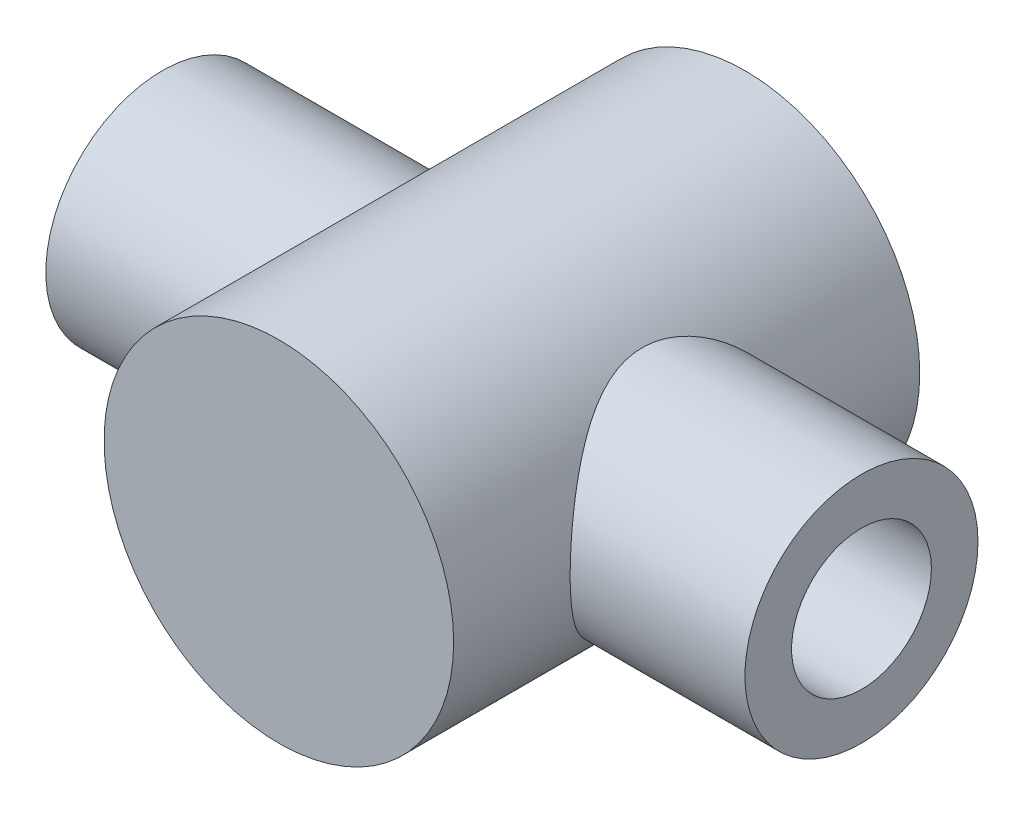
ISO-10303-21;
HEADER;
FILE_DESCRIPTION(('STEP AP214'),'2;1');
FILE_NAME('part.step','',(''),(''),'','','');
FILE_SCHEMA(('AUTOMOTIVE_DESIGN { 1 0 10303 214 1 1 1 1 }'));
ENDSEC;
DATA;
#1=APPLICATION_CONTEXT('core data for automotive mechanical design processes');
#2=APPLICATION_PROTOCOL_DEFINITION('international standard','automotive_design',2000,#1);
#3=PRODUCT_CONTEXT('',#1,'mechanical');
#4=PRODUCT('Part','Part','',(#3));
#5=PRODUCT_RELATED_PRODUCT_CATEGORY('part','',(#4));
#6=PRODUCT_DEFINITION_FORMATION('','',#4);
#7=PRODUCT_DEFINITION_CONTEXT('part definition',#1,'design');
#8=PRODUCT_DEFINITION('design','',#6,#7);
#9=PRODUCT_DEFINITION_SHAPE('','',#8);
#10=(LENGTH_UNIT() NAMED_UNIT(*) SI_UNIT(.MILLI.,.METRE.));
#11=(NAMED_UNIT(*) PLANE_ANGLE_UNIT() SI_UNIT($,.RADIAN.));
#12=(NAMED_UNIT(*) SI_UNIT($,.STERADIAN.) SOLID_ANGLE_UNIT());
#13=UNCERTAINTY_MEASURE_WITH_UNIT(LENGTH_MEASURE(1.E-05),#10,'distance_accuracy_value','');
#14=(GEOMETRIC_REPRESENTATION_CONTEXT(3) GLOBAL_UNCERTAINTY_ASSIGNED_CONTEXT((#13)) GLOBAL_UNIT_ASSIGNED_CONTEXT((#10,
#11,#12)) REPRESENTATION_CONTEXT('',''));
#15=CARTESIAN_POINT('',(0.,0.,0.));
#16=DIRECTION('',(0.,0.,1.));
#17=DIRECTION('',(1.,0.,0.));
#18=AXIS2_PLACEMENT_3D('',#15,#16,#17);
#19=CARTESIAN_POINT('',(0.,0.,40.));
#20=DIRECTION('',(0.,0.,-1.));
#21=DIRECTION('',(-1.,0.,0.));
#22=AXIS2_PLACEMENT_3D('',#19,#20,#21);
#23=CYLINDRICAL_SURFACE('',#22,15.);
#24=CARTESIAN_POINT('',(-15.,0.,30.));
#25=CARTESIAN_POINT('',(-14.9999999330355,-0.25121602505803,29.9999999353495));
#26=CARTESIAN_POINT('',(-14.9936756382587,-0.50243329641179,29.9905209450216));
#27=CARTESIAN_POINT('',(-14.968537725491,-1.00281430621742,29.9527543540569));
#28=CARTESIAN_POINT('',(-14.949724041765,-1.25197803385393,29.9244666544247));
#29=CARTESIAN_POINT('',(-14.900062607298,-1.74639437147615,29.8495001443495));
#30=CARTESIAN_POINT('',(-14.8692101655419,-1.99164541802644,29.8028141647733));
#31=CARTESIAN_POINT('',(-14.7962049328406,-2.47636835109205,29.6917197603869));
#32=CARTESIAN_POINT('',(-14.7540520052543,-2.71584016768893,29.6273111212808));
#33=CARTESIAN_POINT('',(-14.6596225678735,-3.18634157579506,29.4819602405573));
#34=CARTESIAN_POINT('',(-14.6073953835842,-3.41740603302261,29.4010984550164));
#35=CARTESIAN_POINT('',(-14.4937836667137,-3.87103535608821,29.2235793171626));
#36=CARTESIAN_POINT('',(-14.4323991815098,-4.09360026589291,29.1269220465706));
#37=CARTESIAN_POINT('',(-14.3016824454347,-4.52919238259836,28.9187823438108));
#38=CARTESIAN_POINT('',(-14.2323514695008,-4.74222111188152,28.8073022893566));
#39=CARTESIAN_POINT('',(-14.086975078723,-5.15806897823306,28.5703919232153));
#40=CARTESIAN_POINT('',(-14.0109271670256,-5.36088427435106,28.4449564194008));
#41=CARTESIAN_POINT('',(-13.846795493068,-5.77229179252596,28.169880107123));
#42=CARTESIAN_POINT('',(-13.7582376430911,-5.97992610161554,28.0190898124267));
#43=CARTESIAN_POINT('',(-13.5764689970333,-6.38186231730968,27.7030661181971));
#44=CARTESIAN_POINT('',(-13.4832562003888,-6.57615840484502,27.5378264854341));
#45=CARTESIAN_POINT('',(-13.2938516889865,-6.95109161684714,27.1935518264849));
#46=CARTESIAN_POINT('',(-13.1976561722971,-7.13171020600087,27.0144987209747));
#47=CARTESIAN_POINT('',(-13.0042893469472,-7.47849345473134,26.6435373382512));
#48=CARTESIAN_POINT('',(-12.9071183637111,-7.64466276695229,26.4516332345341));
#49=CARTESIAN_POINT('',(-12.6984183321707,-7.98727084465364,26.0241138153235));
#50=CARTESIAN_POINT('',(-12.5870482743966,-8.16117931320375,25.7863846756156));
#51=CARTESIAN_POINT('',(-12.3688469609622,-8.48824389065339,25.2949828836545));
#52=CARTESIAN_POINT('',(-12.2620167396837,-8.64139528736315,25.0413066302189));
#53=CARTESIAN_POINT('',(-12.0567536678671,-8.92554542356295,24.5191637706027));
#54=CARTESIAN_POINT('',(-11.958307425287,-9.05657983313836,24.2507219237275));
#55=CARTESIAN_POINT('',(-11.7736552489426,-9.2953668655437,23.6995014922921));
#56=CARTESIAN_POINT('',(-11.6874497570146,-9.4031186480483,23.416722390721));
#57=CARTESIAN_POINT('',(-11.554164407184,-9.56603073076105,22.9219751266933));
#58=CARTESIAN_POINT('',(-11.5029747857298,-9.62739262612926,22.7131395869155));
#59=CARTESIAN_POINT('',(-11.4105753109273,-9.73672940324514,22.289937274223));
#60=CARTESIAN_POINT('',(-11.3693590511558,-9.78471288169701,22.0755741504336));
#61=CARTESIAN_POINT('',(-11.2983421435493,-9.86663115695275,21.6425809785492));
#62=CARTESIAN_POINT('',(-11.2685273567868,-9.90058335814109,21.4239565709598));
#63=CARTESIAN_POINT('',(-11.221387591901,-9.95398099415626,20.9835887309118));
#64=CARTESIAN_POINT('',(-11.2040626822259,-9.97342634948116,20.7618452813667));
#65=CARTESIAN_POINT('',(-11.1825789027742,-9.99750949727822,20.3159869025666));
#66=CARTESIAN_POINT('',(-11.1784748508786,-10.0020856379335,20.0918659554354));
#67=CARTESIAN_POINT('',(-11.1837650844345,-9.9961699136916,19.6439846703281));
#68=CARTESIAN_POINT('',(-11.1931594157374,-9.98567799761094,19.4202243335797));
#69=CARTESIAN_POINT('',(-11.2250543429254,-9.94981025476011,18.9746874522769));
#70=CARTESIAN_POINT('',(-11.2475646772114,-9.92442336863968,18.7529125062035));
#71=CARTESIAN_POINT('',(-11.3047790826166,-9.85920094420808,18.313112536714));
#72=CARTESIAN_POINT('',(-11.3394833862946,-9.81936513033175,18.0950875848997));
#73=CARTESIAN_POINT('',(-11.4180019094514,-9.72793320006853,17.6736922309987));
#74=CARTESIAN_POINT('',(-11.4613417591393,-9.67693962238987,17.4701015448693));
#75=CARTESIAN_POINT('',(-11.5566568857338,-9.56290804839144,17.0683728775239));
#76=CARTESIAN_POINT('',(-11.6086351042463,-9.49986594811239,16.8702367806307));
#77=CARTESIAN_POINT('',(-11.7754502619445,-9.29354494113032,16.2850346702939));
#78=CARTESIAN_POINT('',(-11.9012104503488,-9.13302364641689,15.9069591042848));
#79=CARTESIAN_POINT('',(-12.1171285127346,-8.84272153741116,15.323856241402));
#80=CARTESIAN_POINT('',(-12.2015387549069,-8.72612786560377,15.1098373489876));
#81=CARTESIAN_POINT('',(-12.3748717362542,-8.47852404512043,14.6921259467744));
#82=CARTESIAN_POINT('',(-12.4637949008305,-8.34751253601214,14.4884344140937));
#83=CARTESIAN_POINT('',(-12.6442740511078,-8.07152743445186,14.0916213405095));
#84=CARTESIAN_POINT('',(-12.7358328434522,-7.92653854045352,13.8985117550921));
#85=CARTESIAN_POINT('',(-12.9196994873306,-7.62317723911379,13.5234781012259));
#86=CARTESIAN_POINT('',(-13.0120073783843,-7.46480412146614,13.341554627315));
#87=CARTESIAN_POINT('',(-13.2155248866167,-7.09947419488298,12.9513484019405));
#88=CARTESIAN_POINT('',(-13.3265151977751,-6.88940798266188,12.7458483161932));
#89=CARTESIAN_POINT('',(-13.5442982668685,-6.45073383646427,12.3531243284252));
#90=CARTESIAN_POINT('',(-13.6510902499499,-6.22212250338512,12.1659037907511));
#91=CARTESIAN_POINT('',(-13.8576700674927,-5.74734305844845,11.8112408388158));
#92=CARTESIAN_POINT('',(-13.9574630115838,-5.50118802469018,11.6437839338812));
#93=CARTESIAN_POINT('',(-14.1474838136551,-4.99223677264768,11.3301173923021));
#94=CARTESIAN_POINT('',(-14.2377143016267,-4.72944516189957,11.1839019094408));
#95=CARTESIAN_POINT('',(-14.3895846157167,-4.24166531219498,10.940900865899));
#96=CARTESIAN_POINT('',(-14.4533619463413,-4.01936273392653,10.8400440204838));
#97=CARTESIAN_POINT('',(-14.5718625564463,-3.5659086899693,10.6541823551827));
#98=CARTESIAN_POINT('',(-14.626587537937,-3.33475889780839,10.5691745549983));
#99=CARTESIAN_POINT('',(-14.7258138746381,-2.86496136705681,10.4160031036509));
#100=CARTESIAN_POINT('',(-14.7703217334326,-2.62631850868929,10.3478287352715));
#101=CARTESIAN_POINT('',(-14.8481652748998,-2.14287716114342,10.2291238039742));
#102=CARTESIAN_POINT('',(-14.88150078571,-1.89807857733481,10.1785935124717));
#103=CARTESIAN_POINT('',(-14.9363289474097,-1.40298657198256,10.0957133431218));
#104=CARTESIAN_POINT('',(-14.9577691603099,-1.15267379959938,10.0634439524512));
#105=CARTESIAN_POINT('',(-14.9880478010909,-0.649559957245906,10.0179227238064));
#106=CARTESIAN_POINT('',(-14.9968862125054,-0.396758884024633,10.0046709106821));
#107=CARTESIAN_POINT('',(-15.0017358975792,0.109232368114872,9.99739598354247));
#108=CARTESIAN_POINT('',(-14.9977476999263,0.362422530565652,10.0033720769905));
#109=CARTESIAN_POINT('',(-14.9770466614902,0.867090784232969,10.0344562723816));
#110=CARTESIAN_POINT('',(-14.9603343637986,1.11856894805903,10.0595635577651));
#111=CARTESIAN_POINT('',(-14.9162207256747,1.60021088099169,10.1260843649813));
#112=CARTESIAN_POINT('',(-14.8896545033154,1.83062905444839,10.1662258257587));
#113=CARTESIAN_POINT('',(-14.8264553228871,2.286750791688,10.2621829460635));
#114=CARTESIAN_POINT('',(-14.7898229314375,2.51245462006972,10.3179977233518));
#115=CARTESIAN_POINT('',(-14.7072292872384,2.95782054801539,10.4446404619179));
#116=CARTESIAN_POINT('',(-14.6612689972306,3.17748326843354,10.5154668738632));
#117=CARTESIAN_POINT('',(-14.5608685744981,3.60976033653901,10.6714173751423));
#118=CARTESIAN_POINT('',(-14.5064251426564,3.82237190283185,10.7565470280585));
#119=CARTESIAN_POINT('',(-14.3865364468578,4.25209030381565,10.9458234001798));
#120=CARTESIAN_POINT('',(-14.3206265538465,4.4686990221519,11.0508056922133));
#121=CARTESIAN_POINT('',(-14.1815800238228,4.89208194000025,11.2750386052661));
#122=CARTESIAN_POINT('',(-14.1084403642545,5.09885197227151,11.3942951983881));
#123=CARTESIAN_POINT('',(-13.9562209237832,5.50184549515243,11.6461879095976));
#124=CARTESIAN_POINT('',(-13.877139647821,5.69806630986327,11.7788273980544));
#125=CARTESIAN_POINT('',(-13.7143680858164,6.07939950359023,12.0566652164583));
#126=CARTESIAN_POINT('',(-13.6306772864208,6.26451064052813,12.2018649462449));
#127=CARTESIAN_POINT('',(-13.4465269082311,6.65160325692351,12.5280538027898));
#128=CARTESIAN_POINT('',(-13.3455103320206,6.85161533719512,12.7110695310914));
#129=CARTESIAN_POINT('',(-13.1413134709237,7.23554778501399,13.0920352038254));
#130=CARTESIAN_POINT('',(-13.0381336512596,7.41947156934853,13.2899819605356));
#131=CARTESIAN_POINT('',(-12.831786990914,7.77089399542676,13.7002988240268));
#132=CARTESIAN_POINT('',(-12.7286202362013,7.93837850837233,13.9126810767084));
#133=CARTESIAN_POINT('',(-12.5248630730048,8.25611378856014,14.3511176960579));
#134=CARTESIAN_POINT('',(-12.4242724021863,8.40636631608101,14.5771706626281));
#135=CARTESIAN_POINT('',(-12.2366511518776,8.67693135617692,15.0227586253772));
#136=CARTESIAN_POINT('',(-12.1491931829413,8.798701217252,15.2412285146246));
#137=CARTESIAN_POINT('',(-11.9809703622396,9.02642731767801,15.68877739975));
#138=CARTESIAN_POINT('',(-11.9002056074433,9.13238332794099,15.9178565492565));
#139=CARTESIAN_POINT('',(-11.7479595311078,9.32741855584938,16.3856692864232));
#140=CARTESIAN_POINT('',(-11.6764646765776,9.4165224648861,16.6243881175329));
#141=CARTESIAN_POINT('',(-11.5452295677016,9.57697422267287,17.1108625978112));
#142=CARTESIAN_POINT('',(-11.4854866126081,9.64832615207156,17.3586161551253));
#143=CARTESIAN_POINT('',(-11.3897704831431,9.76102279918068,17.8165171636202));
#144=CARTESIAN_POINT('',(-11.3514548915623,9.80545611371607,18.0254171822823));
#145=CARTESIAN_POINT('',(-11.2857234393171,9.8810407113455,18.4472831754927));
#146=CARTESIAN_POINT('',(-11.2583053708654,9.91219468486488,18.6602483172938));
#147=CARTESIAN_POINT('',(-11.2153901131429,9.96072687389686,19.0887544010096));
#148=CARTESIAN_POINT('',(-11.1998824275471,9.97811721936675,19.3042929045431));
#149=CARTESIAN_POINT('',(-11.1813575884869,9.99887192737887,19.7365905067501));
#150=CARTESIAN_POINT('',(-11.1783406173109,10.0022360852241,19.953349623191));
#151=CARTESIAN_POINT('',(-11.1849224927768,9.99487528285886,20.3865576421458));
#152=CARTESIAN_POINT('',(-11.1945285412991,9.98414227971974,20.6030062969761));
#153=CARTESIAN_POINT('',(-11.2259822212761,9.94876260555887,21.0338513127226));
#154=CARTESIAN_POINT('',(-11.2478297523767,9.92411604859885,21.2482476904484));
#155=CARTESIAN_POINT('',(-11.3029581148718,9.86128176273312,21.6737436673172));
#156=CARTESIAN_POINT('',(-11.3362494199346,9.82308162817279,21.8848400605356));
#157=CARTESIAN_POINT('',(-11.4131107403506,9.73367199559206,22.3024487680663));
#158=CARTESIAN_POINT('',(-11.4566866343157,9.68245505594956,22.5089583864671));
#159=CARTESIAN_POINT('',(-11.5655388267535,9.55234495109753,22.9706068817912));
#160=CARTESIAN_POINT('',(-11.6335040156423,9.46971376976682,23.2240627037932));
#161=CARTESIAN_POINT('',(-11.7808083684514,9.28581809630263,23.7207212709719));
#162=CARTESIAN_POINT('',(-11.8601514566957,9.18454717174898,23.9639204409432));
#163=CARTESIAN_POINT('',(-12.0274247462764,8.96438401317387,24.4394298982426));
#164=CARTESIAN_POINT('',(-12.1153637978473,8.84547355124955,24.6717285907088));
#165=CARTESIAN_POINT('',(-12.2970901291272,8.59104253624864,25.1245924907115));
#166=CARTESIAN_POINT('',(-12.3908770998534,8.45552286037769,25.3451583170306));
#167=CARTESIAN_POINT('',(-12.5835943779112,8.16602291524329,25.7779814169915));
#168=CARTESIAN_POINT('',(-12.6825868303729,8.01175463180858,25.9900181135007));
#169=CARTESIAN_POINT('',(-12.8818233284634,7.68731964794004,26.4010700860617));
#170=CARTESIAN_POINT('',(-12.9820678307752,7.51714699045038,26.6000804351965));
#171=CARTESIAN_POINT('',(-13.1816297875113,7.16144037138927,26.9844354950966));
#172=CARTESIAN_POINT('',(-13.2809471060737,6.97590419669871,27.1697782297428));
#173=CARTESIAN_POINT('',(-13.4766033774273,6.58999024940345,27.5260207576439));
#174=CARTESIAN_POINT('',(-13.5729423603127,6.38961262683213,27.6969206968648));
#175=CARTESIAN_POINT('',(-13.7742163705596,5.94464767383283,28.0468864178101));
#176=CARTESIAN_POINT('',(-13.8783939266356,5.69784749774641,28.2235894099854));
#177=CARTESIAN_POINT('',(-14.0774919665113,5.18647351593624,28.5553127015469));
#178=CARTESIAN_POINT('',(-14.1724111000986,4.92189712727175,28.710329839779));
#179=CARTESIAN_POINT('',(-14.3501334769257,4.37672916893082,28.9966052188981));
#180=CARTESIAN_POINT('',(-14.4329515653996,4.09615781925748,29.1278926184773));
#181=CARTESIAN_POINT('',(-14.5840038038843,3.52068543509656,29.364908653792));
#182=CARTESIAN_POINT('',(-14.6522430743996,3.22578947664133,29.4706462650709));
#183=CARTESIAN_POINT('',(-14.7585526216257,2.69111020627908,29.6342001425005));
#184=CARTESIAN_POINT('',(-14.7999572935386,2.453635017823,29.6974438948679));
#185=CARTESIAN_POINT('',(-14.8716476970084,1.97308581148121,29.8065080818939));
#186=CARTESIAN_POINT('',(-14.9019355596521,1.73001287618556,29.8523318560137));
#187=CARTESIAN_POINT('',(-14.9506744441808,1.24011776126904,29.9258966801066));
#188=CARTESIAN_POINT('',(-14.9691325832632,0.993297927604442,29.9536486029329));
#189=CARTESIAN_POINT('',(-14.993795624143,0.497652520116127,29.9907006409564));
#190=CARTESIAN_POINT('',(-15.0000000663276,0.248826871409575,30.0000000640356));
#191=CARTESIAN_POINT('',(-15.,0.,30.));
#192=B_SPLINE_CURVE_WITH_KNOTS('',3,(#24,#25,#26,#27,#28,#29,#30,#31,#32,#33,#34,#35,#36,#37,
#38,#39,#40,#41,#42,#43,#44,#45,#46,#47,#48,#49,#50,#51,#52,#53,#54,#55,#56,#57,#58,#59,#60,#61,
#62,#63,#64,#65,#66,#67,#68,#69,#70,#71,#72,#73,#74,#75,#76,#77,#78,#79,#80,#81,#82,#83,#84,#85,
#86,#87,#88,#89,#90,#91,#92,#93,#94,#95,#96,#97,#98,#99,#100,#101,#102,#103,#104,#105,#106,#107,
#108,#109,#110,#111,#112,#113,#114,#115,#116,#117,#118,#119,#120,#121,#122,#123,#124,#125,#126,
#127,#128,#129,#130,#131,#132,#133,#134,#135,#136,#137,#138,#139,#140,#141,#142,#143,#144,#145,
#146,#147,#148,#149,#150,#151,#152,#153,#154,#155,#156,#157,#158,#159,#160,#161,#162,#163,#164,
#165,#166,#167,#168,#169,#170,#171,#172,#173,#174,#175,#176,#177,#178,#179,#180,#181,#182,#183,
#184,#185,#186,#187,#188,#189,#190,#191),.UNSPECIFIED.,.T.,.F.,(4,2,2,2,2,2,2,2,2,2,2,2,2,2,2,2,
2,2,2,2,2,2,2,2,2,2,2,2,2,2,2,2,2,2,2,2,2,2,2,2,2,2,2,2,2,2,2,2,2,2,2,2,2,2,2,2,2,2,2,2,2,2,2,2,
2,2,2,2,2,2,2,2,2,2,2,2,2,2,2,2,2,2,2,4),(0.,0.753394300185717,1.50679256573076,2.2604846936234,
3.0141859352887,3.76428651453101,4.51438321311105,5.26435973397233,6.01461622276406,
6.82821436912433,7.64216523759396,8.45720010773051,9.27197155852477,10.2155659725767,
11.159374240242,12.1016454881405,13.0439507391687,13.7141436311146,14.3839048726876,
15.0528328312319,15.7217644556782,16.3934661372619,17.0651701004973,17.7373734287591,
18.4095895777342,19.0518780381327,19.694385665547,20.9787317460437,21.7519790573574,
22.5252993930816,23.2994761376387,24.0736939939054,25.0149715434142,25.956422009544,
26.8971778596539,27.8376742956463,28.5938374823542,29.3498583343056,30.1053966077373,
30.8609465029599,31.6198011453589,32.3786567793354,33.1374811351664,33.896273104583,
34.6016588818499,35.3070049614494,36.0122782785612,36.7178265661456,37.4657892549015,
38.2140659784522,38.9625316217945,39.7110807894034,40.5781485096025,41.4450316350128,
42.3126534000335,43.1801864568224,43.9743636862577,44.7685524194551,45.5615683509502,
46.3544018230503,47.0046896349387,47.6548456343112,48.3044280077778,48.9540198611609,
49.6039824906945,50.2539397919853,50.9044935435747,51.5554200523821,52.3795636043219,
53.2039920963941,54.0292785280237,54.8545213914148,55.6945962643172,56.534987061841,
57.3754991292033,58.2160027009215,59.1774341078251,60.1390055171883,61.0993872102032,
62.0594310326874,62.8062251677098,63.5528760678118,64.2990773324883,65.045306585219),.UNSPECIFIED.);
#193=CARTESIAN_POINT('',(-15.,0.,30.));
#194=VERTEX_POINT('',#193);
#195=EDGE_CURVE('E34',#194,#194,#192,.T.);
#196=ORIENTED_EDGE('',*,*,#195,.T.);
#197=EDGE_LOOP('',(#196));
#198=FACE_BOUND('',#197,.T.);
#199=CARTESIAN_POINT('',(15.,0.,10.));
#200=CARTESIAN_POINT('',(14.9999999330355,-0.25121602505803,10.0000000646505));
#201=CARTESIAN_POINT('',(14.9936756382587,-0.50243329641179,10.0094790549784));
#202=CARTESIAN_POINT('',(14.968537725491,-1.00281430621742,10.0472456459431));
#203=CARTESIAN_POINT('',(14.949724041765,-1.25197803385393,10.0755333455753));
#204=CARTESIAN_POINT('',(14.900062607298,-1.74639437147615,10.1504998556505));
#205=CARTESIAN_POINT('',(14.8692101655419,-1.99164541802644,10.1971858352267));
#206=CARTESIAN_POINT('',(14.7962049328406,-2.47636835109205,10.3082802396131));
#207=CARTESIAN_POINT('',(14.7540520052543,-2.71584016768893,10.3726888787192));
#208=CARTESIAN_POINT('',(14.6596225678735,-3.18634157579506,10.5180397594427));
#209=CARTESIAN_POINT('',(14.6073953835842,-3.41740603302261,10.5989015449836));
#210=CARTESIAN_POINT('',(14.4937836667137,-3.87103535608821,10.7764206828374));
#211=CARTESIAN_POINT('',(14.4323991815098,-4.09360026589291,10.8730779534294));
#212=CARTESIAN_POINT('',(14.3016824454347,-4.52919238259836,11.0812176561892));
#213=CARTESIAN_POINT('',(14.2323514695008,-4.74222111188152,11.1926977106434));
#214=CARTESIAN_POINT('',(14.086975078723,-5.15806897823306,11.4296080767847));
#215=CARTESIAN_POINT('',(14.0109271670256,-5.36088427435106,11.5550435805992));
#216=CARTESIAN_POINT('',(13.846795493068,-5.77229179252596,11.830119892877));
#217=CARTESIAN_POINT('',(13.7582376430911,-5.97992610161555,11.9809101875733));
#218=CARTESIAN_POINT('',(13.5764689970333,-6.38186231730968,12.2969338818029));
#219=CARTESIAN_POINT('',(13.4832562003888,-6.57615840484502,12.4621735145659));
#220=CARTESIAN_POINT('',(13.2938516889865,-6.95109161684714,12.8064481735152));
#221=CARTESIAN_POINT('',(13.1976561722972,-7.13171020600087,12.9855012790253));
#222=CARTESIAN_POINT('',(13.0042893469472,-7.47849345473134,13.3564626617488));
#223=CARTESIAN_POINT('',(12.9071183637111,-7.64466276695229,13.5483667654659));
#224=CARTESIAN_POINT('',(12.6984183321707,-7.98727084465364,13.9758861846765));
#225=CARTESIAN_POINT('',(12.5870482743966,-8.16117931320375,14.2136153243844));
#226=CARTESIAN_POINT('',(12.3688469609622,-8.48824389065339,14.7050171163455));
#227=CARTESIAN_POINT('',(12.2620167396837,-8.64139528736315,14.9586933697811));
#228=CARTESIAN_POINT('',(12.0567536678672,-8.92554542356295,15.4808362293973));
#229=CARTESIAN_POINT('',(11.958307425287,-9.05657983313836,15.7492780762725));
#230=CARTESIAN_POINT('',(11.7736552489426,-9.2953668655437,16.3004985077079));
#231=CARTESIAN_POINT('',(11.6874497570146,-9.4031186480483,16.583277609279));
#232=CARTESIAN_POINT('',(11.554164407184,-9.56603073076105,17.0780248733067));
#233=CARTESIAN_POINT('',(11.5029747857298,-9.62739262612926,17.2868604130845));
#234=CARTESIAN_POINT('',(11.4105753109273,-9.73672940324514,17.710062725777));
#235=CARTESIAN_POINT('',(11.3693590511558,-9.78471288169701,17.9244258495664));
#236=CARTESIAN_POINT('',(11.2983421435493,-9.86663115695275,18.3574190214508));
#237=CARTESIAN_POINT('',(11.2685273567868,-9.90058335814109,18.5760434290402));
#238=CARTESIAN_POINT('',(11.221387591901,-9.95398099415626,19.0164112690882));
#239=CARTESIAN_POINT('',(11.2040626822259,-9.97342634948116,19.2381547186333));
#240=CARTESIAN_POINT('',(11.1825789027742,-9.99750949727822,19.6840130974334));
#241=CARTESIAN_POINT('',(11.1784748508786,-10.0020856379335,19.9081340445646));
#242=CARTESIAN_POINT('',(11.1837650844345,-9.9961699136916,20.3560153296719));
#243=CARTESIAN_POINT('',(11.1931594157374,-9.98567799761094,20.5797756664203));
#244=CARTESIAN_POINT('',(11.2250543429254,-9.94981025476011,21.0253125477231));
#245=CARTESIAN_POINT('',(11.2475646772114,-9.92442336863968,21.2470874937965));
#246=CARTESIAN_POINT('',(11.3047790826166,-9.85920094420808,21.686887463286));
#247=CARTESIAN_POINT('',(11.3394833862946,-9.81936513033175,21.9049124151003));
#248=CARTESIAN_POINT('',(11.4180019094514,-9.72793320006853,22.3263077690013));
#249=CARTESIAN_POINT('',(11.4613417591393,-9.67693962238987,22.5298984551307));
#250=CARTESIAN_POINT('',(11.5566568857338,-9.56290804839144,22.9316271224761));
#251=CARTESIAN_POINT('',(11.6086351042463,-9.49986594811239,23.1297632193693));
#252=CARTESIAN_POINT('',(11.7754502619445,-9.29354494113033,23.7149653297061));
#253=CARTESIAN_POINT('',(11.9012104503488,-9.13302364641689,24.0930408957152));
#254=CARTESIAN_POINT('',(12.1171285127346,-8.84272153741116,24.676143758598));
#255=CARTESIAN_POINT('',(12.2015387549069,-8.72612786560377,24.8901626510124));
#256=CARTESIAN_POINT('',(12.3748717362542,-8.47852404512043,25.3078740532256));
#257=CARTESIAN_POINT('',(12.4637949008305,-8.34751253601214,25.5115655859063));
#258=CARTESIAN_POINT('',(12.6442740511078,-8.07152743445186,25.9083786594905));
#259=CARTESIAN_POINT('',(12.7358328434522,-7.92653854045352,26.1014882449079));
#260=CARTESIAN_POINT('',(12.9196994873306,-7.62317723911379,26.4765218987741));
#261=CARTESIAN_POINT('',(13.0120073783843,-7.46480412146614,26.658445372685));
#262=CARTESIAN_POINT('',(13.2155248866167,-7.09947419488298,27.0486515980595));
#263=CARTESIAN_POINT('',(13.3265151977751,-6.88940798266188,27.2541516838068));
#264=CARTESIAN_POINT('',(13.5442982668685,-6.45073383646427,27.6468756715748));
#265=CARTESIAN_POINT('',(13.6510902499499,-6.22212250338512,27.8340962092489));
#266=CARTESIAN_POINT('',(13.8576700674927,-5.74734305844845,28.1887591611842));
#267=CARTESIAN_POINT('',(13.9574630115838,-5.50118802469018,28.3562160661188));
#268=CARTESIAN_POINT('',(14.1474838136551,-4.99223677264768,28.6698826076979));
#269=CARTESIAN_POINT('',(14.2377143016267,-4.72944516189957,28.8160980905592));
#270=CARTESIAN_POINT('',(14.3895846157167,-4.24166531219498,29.059099134101));
#271=CARTESIAN_POINT('',(14.4533619463413,-4.01936273392653,29.1599559795162));
#272=CARTESIAN_POINT('',(14.5718625564463,-3.56590868996929,29.3458176448173));
#273=CARTESIAN_POINT('',(14.626587537937,-3.33475889780839,29.4308254450017));
#274=CARTESIAN_POINT('',(14.7258138746381,-2.86496136705681,29.5839968963491));
#275=CARTESIAN_POINT('',(14.7703217334326,-2.62631850868929,29.6521712647285));
#276=CARTESIAN_POINT('',(14.8481652748998,-2.14287716114342,29.7708761960258));
#277=CARTESIAN_POINT('',(14.88150078571,-1.8980785773348,29.8214064875283));
#278=CARTESIAN_POINT('',(14.9363289474097,-1.40298657198255,29.9042866568782));
#279=CARTESIAN_POINT('',(14.9577691603099,-1.15267379959938,29.9365560475488));
#280=CARTESIAN_POINT('',(14.9880478010909,-0.649559957245906,29.9820772761936));
#281=CARTESIAN_POINT('',(14.9968862125054,-0.396758884024632,29.9953290893179));
#282=CARTESIAN_POINT('',(15.0017358975792,0.109232368114873,30.0026040164575));
#283=CARTESIAN_POINT('',(14.9977476999263,0.362422530565654,29.9966279230095));
#284=CARTESIAN_POINT('',(14.9770466614902,0.867090784232971,29.9655437276184));
#285=CARTESIAN_POINT('',(14.9603343637986,1.11856894805904,29.9404364422349));
#286=CARTESIAN_POINT('',(14.9162207256747,1.60021088099169,29.8739156350187));
#287=CARTESIAN_POINT('',(14.8896545033154,1.83062905444839,29.8337741742413));
#288=CARTESIAN_POINT('',(14.8264553228871,2.28675079168801,29.7378170539365));
#289=CARTESIAN_POINT('',(14.7898229314375,2.51245462006972,29.6820022766482));
#290=CARTESIAN_POINT('',(14.7072292872384,2.95782054801539,29.5553595380821));
#291=CARTESIAN_POINT('',(14.6612689972306,3.17748326843355,29.4845331261368));
#292=CARTESIAN_POINT('',(14.5608685744981,3.60976033653901,29.3285826248577));
#293=CARTESIAN_POINT('',(14.5064251426564,3.82237190283186,29.2434529719415));
#294=CARTESIAN_POINT('',(14.3865364468578,4.25209030381566,29.0541765998202));
#295=CARTESIAN_POINT('',(14.3206265538465,4.46869902215191,28.9491943077867));
#296=CARTESIAN_POINT('',(14.1815800238228,4.89208194000025,28.7249613947339));
#297=CARTESIAN_POINT('',(14.1084403642545,5.09885197227151,28.6057048016119));
#298=CARTESIAN_POINT('',(13.9562209237831,5.50184549515243,28.3538120904024));
#299=CARTESIAN_POINT('',(13.877139647821,5.69806630986327,28.2211726019456));
#300=CARTESIAN_POINT('',(13.7143680858164,6.07939950359023,27.9433347835417));
#301=CARTESIAN_POINT('',(13.6306772864208,6.26451064052813,27.7981350537551));
#302=CARTESIAN_POINT('',(13.4465269082311,6.65160325692352,27.4719461972102));
#303=CARTESIAN_POINT('',(13.3455103320206,6.85161533719513,27.2889304689086));
#304=CARTESIAN_POINT('',(13.1413134709237,7.23554778501399,26.9079647961746));
#305=CARTESIAN_POINT('',(13.0381336512596,7.41947156934853,26.7100180394644));
#306=CARTESIAN_POINT('',(12.831786990914,7.77089399542675,26.2997011759732));
#307=CARTESIAN_POINT('',(12.7286202362013,7.93837850837233,26.0873189232916));
#308=CARTESIAN_POINT('',(12.5248630730048,8.25611378856013,25.6488823039421));
#309=CARTESIAN_POINT('',(12.4242724021863,8.40636631608101,25.4228293373719));
#310=CARTESIAN_POINT('',(12.2366511518776,8.67693135617693,24.9772413746227));
#311=CARTESIAN_POINT('',(12.1491931829413,8.798701217252,24.7587714853754));
#312=CARTESIAN_POINT('',(11.9809703622396,9.02642731767801,24.31122260025));
#313=CARTESIAN_POINT('',(11.9002056074433,9.13238332794099,24.0821434507435));
#314=CARTESIAN_POINT('',(11.7479595311078,9.32741855584938,23.6143307135768));
#315=CARTESIAN_POINT('',(11.6764646765776,9.41652246488609,23.3756118824671));
#316=CARTESIAN_POINT('',(11.5452295677016,9.57697422267287,22.8891374021888));
#317=CARTESIAN_POINT('',(11.4854866126081,9.64832615207155,22.6413838448747));
#318=CARTESIAN_POINT('',(11.3897704831431,9.76102279918068,22.1834828363798));
#319=CARTESIAN_POINT('',(11.3514548915623,9.80545611371607,21.9745828177177));
#320=CARTESIAN_POINT('',(11.2857234393171,9.88104071134551,21.5527168245073));
#321=CARTESIAN_POINT('',(11.2583053708654,9.91219468486488,21.3397516827062));
#322=CARTESIAN_POINT('',(11.2153901131429,9.96072687389686,20.9112455989904));
#323=CARTESIAN_POINT('',(11.1998824275471,9.97811721936676,20.6957070954569));
#324=CARTESIAN_POINT('',(11.1813575884869,9.99887192737887,20.2634094932499));
#325=CARTESIAN_POINT('',(11.1783406173109,10.0022360852241,20.046650376809));
#326=CARTESIAN_POINT('',(11.1849224927768,9.99487528285886,19.6134423578542));
#327=CARTESIAN_POINT('',(11.1945285412991,9.98414227971974,19.3969937030239));
#328=CARTESIAN_POINT('',(11.2259822212761,9.94876260555887,18.9661486872774));
#329=CARTESIAN_POINT('',(11.2478297523767,9.92411604859885,18.7517523095516));
#330=CARTESIAN_POINT('',(11.3029581148718,9.86128176273312,18.3262563326828));
#331=CARTESIAN_POINT('',(11.3362494199346,9.82308162817279,18.1151599394644));
#332=CARTESIAN_POINT('',(11.4131107403506,9.73367199559206,17.6975512319337));
#333=CARTESIAN_POINT('',(11.4566866343157,9.68245505594956,17.4910416135329));
#334=CARTESIAN_POINT('',(11.5655388267535,9.55234495109753,17.0293931182088));
#335=CARTESIAN_POINT('',(11.6335040156423,9.46971376976682,16.7759372962068));
#336=CARTESIAN_POINT('',(11.7808083684514,9.28581809630263,16.2792787290281));
#337=CARTESIAN_POINT('',(11.8601514566957,9.18454717174898,16.0360795590568));
#338=CARTESIAN_POINT('',(12.0274247462764,8.96438401317387,15.5605701017574));
#339=CARTESIAN_POINT('',(12.1153637978473,8.84547355124955,15.3282714092912));
#340=CARTESIAN_POINT('',(12.2970901291272,8.59104253624864,14.8754075092885));
#341=CARTESIAN_POINT('',(12.3908770998534,8.45552286037769,14.6548416829694));
#342=CARTESIAN_POINT('',(12.5835943779112,8.16602291524329,14.2220185830085));
#343=CARTESIAN_POINT('',(12.6825868303729,8.01175463180858,14.0099818864993));
#344=CARTESIAN_POINT('',(12.8818233284634,7.68731964794004,13.5989299139383));
#345=CARTESIAN_POINT('',(12.9820678307752,7.51714699045038,13.3999195648035));
#346=CARTESIAN_POINT('',(13.1816297875113,7.16144037138927,13.0155645049034));
#347=CARTESIAN_POINT('',(13.2809471060737,6.9759041966987,12.8302217702572));
#348=CARTESIAN_POINT('',(13.4766033774273,6.58999024940345,12.4739792423561));
#349=CARTESIAN_POINT('',(13.5729423603127,6.38961262683213,12.3030793031352));
#350=CARTESIAN_POINT('',(13.7742163705596,5.94464767383283,11.9531135821899));
#351=CARTESIAN_POINT('',(13.8783939266356,5.69784749774641,11.7764105900146));
#352=CARTESIAN_POINT('',(14.0774919665113,5.18647351593625,11.4446872984531));
#353=CARTESIAN_POINT('',(14.1724111000986,4.92189712727175,11.289670160221));
#354=CARTESIAN_POINT('',(14.3501334769257,4.37672916893081,11.0033947811019));
#355=CARTESIAN_POINT('',(14.4329515653996,4.09615781925747,10.8721073815227));
#356=CARTESIAN_POINT('',(14.5840038038843,3.52068543509656,10.635091346208));
#357=CARTESIAN_POINT('',(14.6522430743996,3.22578947664133,10.5293537349291));
#358=CARTESIAN_POINT('',(14.7585526216257,2.69111020627907,10.3657998574995));
#359=CARTESIAN_POINT('',(14.7999572935386,2.453635017823,10.3025561051321));
#360=CARTESIAN_POINT('',(14.8716476970084,1.97308581148121,10.1934919181061));
#361=CARTESIAN_POINT('',(14.9019355596521,1.73001287618556,10.1476681439863));
#362=CARTESIAN_POINT('',(14.9506744441808,1.24011776126903,10.0741033198934));
#363=CARTESIAN_POINT('',(14.9691325832632,0.99329792760444,10.0463513970671));
#364=CARTESIAN_POINT('',(14.993795624143,0.497652520116126,10.0092993590436));
#365=CARTESIAN_POINT('',(15.0000000663276,0.248826871409575,9.99999993596436));
#366=CARTESIAN_POINT('',(15.,0.,10.));
#367=B_SPLINE_CURVE_WITH_KNOTS('',3,(#199,#200,#201,#202,#203,#204,#205,#206,#207,#208,#209,
#210,#211,#212,#213,#214,#215,#216,#217,#218,#219,#220,#221,#222,#223,#224,#225,#226,#227,#228,
#229,#230,#231,#232,#233,#234,#235,#236,#237,#238,#239,#240,#241,#242,#243,#244,#245,#246,#247,
#248,#249,#250,#251,#252,#253,#254,#255,#256,#257,#258,#259,#260,#261,#262,#263,#264,#265,#266,
#267,#268,#269,#270,#271,#272,#273,#274,#275,#276,#277,#278,#279,#280,#281,#282,#283,#284,#285,
#286,#287,#288,#289,#290,#291,#292,#293,#294,#295,#296,#297,#298,#299,#300,#301,#302,#303,#304,
#305,#306,#307,#308,#309,#310,#311,#312,#313,#314,#315,#316,#317,#318,#319,#320,#321,#322,#323,
#324,#325,#326,#327,#328,#329,#330,#331,#332,#333,#334,#335,#336,#337,#338,#339,#340,#341,#342,
#343,#344,#345,#346,#347,#348,#349,#350,#351,#352,#353,#354,#355,#356,#357,#358,#359,#360,#361,
#362,#363,#364,#365,#366),.UNSPECIFIED.,.T.,.F.,(4,2,2,2,2,2,2,2,2,2,2,2,2,2,2,2,2,2,2,2,2,2,2,
2,2,2,2,2,2,2,2,2,2,2,2,2,2,2,2,2,2,2,2,2,2,2,2,2,2,2,2,2,2,2,2,2,2,2,2,2,2,2,2,2,2,2,2,2,2,2,2,
2,2,2,2,2,2,2,2,2,2,2,2,4),(0.,0.753394300185717,1.50679256573076,2.2604846936234,
3.0141859352887,3.76428651453101,4.51438321311105,5.26435973397233,6.01461622276406,
6.82821436912433,7.64216523759396,8.45720010773052,9.27197155852477,10.2155659725767,
11.159374240242,12.1016454881405,13.0439507391687,13.7141436311146,14.3839048726876,
15.0528328312319,15.7217644556782,16.3934661372619,17.0651701004973,17.7373734287591,
18.4095895777342,19.0518780381327,19.694385665547,20.9787317460438,21.7519790573574,
22.5252993930816,23.2994761376387,24.0736939939054,25.0149715434142,25.956422009544,
26.8971778596539,27.8376742956463,28.5938374823542,29.3498583343056,30.1053966077373,
30.8609465029599,31.6198011453589,32.3786567793354,33.1374811351664,33.896273104583,
34.6016588818499,35.3070049614494,36.0122782785612,36.7178265661456,37.4657892549015,
38.2140659784522,38.9625316217945,39.7110807894034,40.5781485096025,41.4450316350128,
42.3126534000335,43.1801864568224,43.9743636862577,44.7685524194551,45.5615683509502,
46.3544018230503,47.0046896349387,47.6548456343112,48.3044280077778,48.9540198611609,
49.6039824906945,50.2539397919853,50.9044935435747,51.5554200523821,52.3795636043219,
53.2039920963941,54.0292785280237,54.8545213914148,55.6945962643172,56.534987061841,
57.3754991292033,58.2160027009215,59.1774341078251,60.1390055171883,61.0993872102032,
62.0594310326874,62.8062251677098,63.5528760678118,64.2990773324884,65.045306585219),.UNSPECIFIED.);
#368=CARTESIAN_POINT('',(15.,0.,10.));
#369=VERTEX_POINT('',#368);
#370=EDGE_CURVE('E50',#369,#369,#367,.T.);
#371=ORIENTED_EDGE('',*,*,#370,.T.);
#372=EDGE_LOOP('',(#371));
#373=FACE_BOUND('',#372,.T.);
#374=CARTESIAN_POINT('',(0.,0.,40.));
#375=DIRECTION('',(0.,0.,1.));
#376=DIRECTION('',(1.,0.,0.));
#377=AXIS2_PLACEMENT_3D('',#374,#375,#376);
#378=CIRCLE('',#377,15.);
#379=CARTESIAN_POINT('',(15.,0.,40.));
#380=VERTEX_POINT('',#379);
#381=EDGE_CURVE('E11',#380,#380,#378,.T.);
#382=ORIENTED_EDGE('',*,*,#381,.F.);
#383=EDGE_LOOP('',(#382));
#384=FACE_BOUND('',#383,.T.);
#385=CARTESIAN_POINT('',(0.,0.,0.));
#386=DIRECTION('',(0.,0.,1.));
#387=DIRECTION('',(1.,0.,0.));
#388=AXIS2_PLACEMENT_3D('',#385,#386,#387);
#389=CIRCLE('',#388,15.);
#390=CARTESIAN_POINT('',(15.,0.,0.));
#391=VERTEX_POINT('',#390);
#392=EDGE_CURVE('E41',#391,#391,#389,.T.);
#393=ORIENTED_EDGE('',*,*,#392,.T.);
#394=EDGE_LOOP('',(#393));
#395=FACE_BOUND('',#394,.T.);
#396=ADVANCED_FACE('F30',(#198,#373,#384,#395),#23,.T.);
#397=CARTESIAN_POINT('',(0.,0.,40.));
#398=DIRECTION('',(0.,0.,1.));
#399=DIRECTION('',(1.,0.,0.));
#400=AXIS2_PLACEMENT_3D('',#397,#398,#399);
#401=PLANE('',#400);
#402=ORIENTED_EDGE('',*,*,#381,.T.);
#403=EDGE_LOOP('',(#402));
#404=FACE_BOUND('',#403,.T.);
#405=ADVANCED_FACE('F63',(#404),#401,.T.);
#406=CARTESIAN_POINT('',(0.,0.,0.));
#407=DIRECTION('',(0.,0.,1.));
#408=DIRECTION('',(1.,0.,0.));
#409=AXIS2_PLACEMENT_3D('',#406,#407,#408);
#410=PLANE('',#409);
#411=ORIENTED_EDGE('',*,*,#392,.F.);
#412=EDGE_LOOP('',(#411));
#413=FACE_BOUND('',#412,.T.);
#414=ADVANCED_FACE('F66',(#413),#410,.F.);
#415=CARTESIAN_POINT('',(30.,0.,20.));
#416=DIRECTION('',(1.,0.,0.));
#417=DIRECTION('',(0.,0.,-1.));
#418=AXIS2_PLACEMENT_3D('',#415,#416,#417);
#419=PLANE('',#418);
#420=CARTESIAN_POINT('',(30.,0.,20.));
#421=DIRECTION('',(1.,0.,0.));
#422=DIRECTION('',(0.,0.,-1.));
#423=AXIS2_PLACEMENT_3D('',#420,#421,#422);
#424=CIRCLE('',#423,6.);
#425=CARTESIAN_POINT('',(30.,0.,14.));
#426=VERTEX_POINT('',#425);
#427=EDGE_CURVE('E97',#426,#426,#424,.T.);
#428=ORIENTED_EDGE('',*,*,#427,.F.);
#429=EDGE_LOOP('',(#428));
#430=FACE_BOUND('',#429,.T.);
#431=CARTESIAN_POINT('',(30.,0.,20.));
#432=DIRECTION('',(1.,0.,0.));
#433=DIRECTION('',(0.,0.,-1.));
#434=AXIS2_PLACEMENT_3D('',#431,#432,#433);
#435=CIRCLE('',#434,10.);
#436=CARTESIAN_POINT('',(30.,0.,10.));
#437=VERTEX_POINT('',#436);
#438=EDGE_CURVE('E92',#437,#437,#435,.T.);
#439=ORIENTED_EDGE('',*,*,#438,.T.);
#440=EDGE_LOOP('',(#439));
#441=FACE_BOUND('',#440,.T.);
#442=ADVANCED_FACE('F68',(#430,#441),#419,.T.);
#443=CARTESIAN_POINT('',(-30.,0.,20.));
#444=DIRECTION('',(1.,0.,0.));
#445=DIRECTION('',(0.,0.,-1.));
#446=AXIS2_PLACEMENT_3D('',#443,#444,#445);
#447=CYLINDRICAL_SURFACE('',#446,10.);
#448=ORIENTED_EDGE('',*,*,#438,.F.);
#449=EDGE_LOOP('',(#448));
#450=FACE_BOUND('',#449,.T.);
#451=ORIENTED_EDGE('',*,*,#370,.F.);
#452=EDGE_LOOP('',(#451));
#453=FACE_BOUND('',#452,.T.);
#454=ADVANCED_FACE('F60',(#450,#453),#447,.T.);
#455=CARTESIAN_POINT('',(-30.,0.,20.));
#456=DIRECTION('',(1.,0.,0.));
#457=DIRECTION('',(0.,0.,-1.));
#458=AXIS2_PLACEMENT_3D('',#455,#456,#457);
#459=CIRCLE('',#458,10.);
#460=CARTESIAN_POINT('',(-30.,0.,10.));
#461=VERTEX_POINT('',#460);
#462=EDGE_CURVE('E48',#461,#461,#459,.T.);
#463=ORIENTED_EDGE('',*,*,#462,.T.);
#464=EDGE_LOOP('',(#463));
#465=FACE_BOUND('',#464,.T.);
#466=ORIENTED_EDGE('',*,*,#195,.F.);
#467=EDGE_LOOP('',(#466));
#468=FACE_BOUND('',#467,.T.);
#469=ADVANCED_FACE('F54',(#465,#468),#447,.T.);
#470=CARTESIAN_POINT('',(-30.,0.,20.));
#471=DIRECTION('',(1.,0.,0.));
#472=DIRECTION('',(0.,0.,-1.));
#473=AXIS2_PLACEMENT_3D('',#470,#471,#472);
#474=PLANE('',#473);
#475=ORIENTED_EDGE('',*,*,#462,.F.);
#476=EDGE_LOOP('',(#475));
#477=FACE_BOUND('',#476,.T.);
#478=ADVANCED_FACE('F59',(#477),#474,.F.);
#479=CARTESIAN_POINT('',(20.,0.,20.));
#480=DIRECTION('',(1.,0.,0.));
#481=DIRECTION('',(0.,0.,-1.));
#482=AXIS2_PLACEMENT_3D('',#479,#480,#481);
#483=CYLINDRICAL_SURFACE('',#482,6.);
#484=CARTESIAN_POINT('',(20.,0.,20.));
#485=DIRECTION('',(1.,0.,0.));
#486=DIRECTION('',(0.,0.,-1.));
#487=AXIS2_PLACEMENT_3D('',#484,#485,#486);
#488=CIRCLE('',#487,6.);
#489=CARTESIAN_POINT('',(20.,0.,14.));
#490=VERTEX_POINT('',#489);
#491=EDGE_CURVE('E94',#490,#490,#488,.T.);
#492=ORIENTED_EDGE('',*,*,#491,.F.);
#493=EDGE_LOOP('',(#492));
#494=FACE_BOUND('',#493,.T.);
#495=ORIENTED_EDGE('',*,*,#427,.T.);
#496=EDGE_LOOP('',(#495));
#497=FACE_BOUND('',#496,.T.);
#498=ADVANCED_FACE('F103',(#494,#497),#483,.F.);
#499=CARTESIAN_POINT('',(20.,0.,20.));
#500=DIRECTION('',(1.,0.,0.));
#501=DIRECTION('',(0.,0.,-1.));
#502=AXIS2_PLACEMENT_3D('',#499,#500,#501);
#503=PLANE('',#502);
#504=ORIENTED_EDGE('',*,*,#491,.T.);
#505=EDGE_LOOP('',(#504));
#506=FACE_BOUND('',#505,.T.);
#507=ADVANCED_FACE('F105',(#506),#503,.T.);
#508=CLOSED_SHELL('',(#396,#405,#414,#442,#454,#469,#478,#498,#507));
#509=MANIFOLD_SOLID_BREP('B2',#508);
#510=ADVANCED_BREP_SHAPE_REPRESENTATION('',(#18,#509),#14);
#511=SHAPE_DEFINITION_REPRESENTATION(#9,#510);
ENDSEC;
END-ISO-10303-21;
